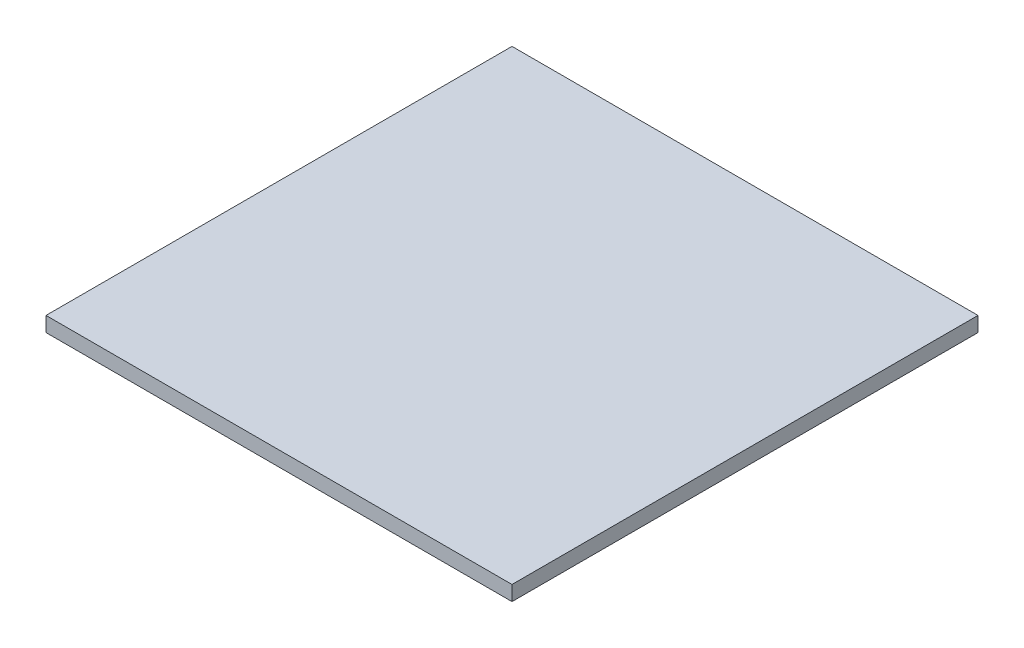
ISO-10303-21;
HEADER;
FILE_DESCRIPTION(('STEP AP214'),'2;1');
FILE_NAME('part.step','',(''),(''),'','','');
FILE_SCHEMA(('AUTOMOTIVE_DESIGN { 1 0 10303 214 1 1 1 1 }'));
ENDSEC;
DATA;
#1=APPLICATION_CONTEXT('core data for automotive mechanical design processes');
#2=APPLICATION_PROTOCOL_DEFINITION('international standard','automotive_design',2000,#1);
#3=PRODUCT_CONTEXT('',#1,'mechanical');
#4=PRODUCT('Part','Part','',(#3));
#5=PRODUCT_RELATED_PRODUCT_CATEGORY('part','',(#4));
#6=PRODUCT_DEFINITION_FORMATION('','',#4);
#7=PRODUCT_DEFINITION_CONTEXT('part definition',#1,'design');
#8=PRODUCT_DEFINITION('design','',#6,#7);
#9=PRODUCT_DEFINITION_SHAPE('','',#8);
#10=(LENGTH_UNIT() NAMED_UNIT(*) SI_UNIT(.MILLI.,.METRE.));
#11=(NAMED_UNIT(*) PLANE_ANGLE_UNIT() SI_UNIT($,.RADIAN.));
#12=(NAMED_UNIT(*) SI_UNIT($,.STERADIAN.) SOLID_ANGLE_UNIT());
#13=UNCERTAINTY_MEASURE_WITH_UNIT(LENGTH_MEASURE(1.E-05),#10,'distance_accuracy_value','');
#14=(GEOMETRIC_REPRESENTATION_CONTEXT(3) GLOBAL_UNCERTAINTY_ASSIGNED_CONTEXT((#13)) GLOBAL_UNIT_ASSIGNED_CONTEXT((#10,
#11,#12)) REPRESENTATION_CONTEXT('',''));
#15=CARTESIAN_POINT('',(0.,0.,0.));
#16=DIRECTION('',(0.,0.,1.));
#17=DIRECTION('',(1.,0.,0.));
#18=AXIS2_PLACEMENT_3D('',#15,#16,#17);
#19=CARTESIAN_POINT('',(47.,3.,47.));
#20=DIRECTION('',(-1.,0.,0.));
#21=DIRECTION('',(0.,0.,1.));
#22=AXIS2_PLACEMENT_3D('',#19,#20,#21);
#23=PLANE('',#22);
#24=DIRECTION('',(0.,0.,-1.));
#25=VECTOR('',#24,1.);
#26=CARTESIAN_POINT('',(47.,0.,47.));
#27=LINE('',#26,#25);
#28=CARTESIAN_POINT('',(47.,0.,47.));
#29=VERTEX_POINT('',#28);
#30=CARTESIAN_POINT('',(47.,0.,-47.));
#31=VERTEX_POINT('',#30);
#32=EDGE_CURVE('E107',#29,#31,#27,.T.);
#33=ORIENTED_EDGE('',*,*,#32,.T.);
#34=DIRECTION('',(0.,-1.,0.));
#35=VECTOR('',#34,1.);
#36=CARTESIAN_POINT('',(47.,3.,-47.));
#37=LINE('',#36,#35);
#38=CARTESIAN_POINT('',(47.,3.,-47.));
#39=VERTEX_POINT('',#38);
#40=EDGE_CURVE('E11',#39,#31,#37,.T.);
#41=ORIENTED_EDGE('',*,*,#40,.F.);
#42=DIRECTION('',(0.,0.,-1.));
#43=VECTOR('',#42,1.);
#44=CARTESIAN_POINT('',(47.,3.,47.));
#45=LINE('',#44,#43);
#46=CARTESIAN_POINT('',(47.,3.,47.));
#47=VERTEX_POINT('',#46);
#48=EDGE_CURVE('E91',#47,#39,#45,.T.);
#49=ORIENTED_EDGE('',*,*,#48,.F.);
#50=DIRECTION('',(0.,-1.,0.));
#51=VECTOR('',#50,1.);
#52=CARTESIAN_POINT('',(47.,3.,47.));
#53=LINE('',#52,#51);
#54=EDGE_CURVE('E103',#47,#29,#53,.T.);
#55=ORIENTED_EDGE('',*,*,#54,.T.);
#56=EDGE_LOOP('',(#33,#41,#49,#55));
#57=FACE_BOUND('',#56,.T.);
#58=ADVANCED_FACE('F39',(#57),#23,.F.);
#59=CARTESIAN_POINT('',(-47.,3.,-47.));
#60=DIRECTION('',(0.,0.,1.));
#61=DIRECTION('',(1.,0.,0.));
#62=AXIS2_PLACEMENT_3D('',#59,#60,#61);
#63=PLANE('',#62);
#64=DIRECTION('',(-1.,0.,0.));
#65=VECTOR('',#64,1.);
#66=CARTESIAN_POINT('',(-47.,0.,-47.));
#67=LINE('',#66,#65);
#68=CARTESIAN_POINT('',(-47.,0.,-47.));
#69=VERTEX_POINT('',#68);
#70=EDGE_CURVE('E96',#31,#69,#67,.T.);
#71=ORIENTED_EDGE('',*,*,#70,.T.);
#72=DIRECTION('',(0.,-1.,0.));
#73=VECTOR('',#72,1.);
#74=CARTESIAN_POINT('',(-47.,3.,-47.));
#75=LINE('',#74,#73);
#76=CARTESIAN_POINT('',(-47.,3.,-47.));
#77=VERTEX_POINT('',#76);
#78=EDGE_CURVE('E48',#77,#69,#75,.T.);
#79=ORIENTED_EDGE('',*,*,#78,.F.);
#80=DIRECTION('',(-1.,0.,0.));
#81=VECTOR('',#80,1.);
#82=CARTESIAN_POINT('',(-47.,3.,-47.));
#83=LINE('',#82,#81);
#84=EDGE_CURVE('E86',#39,#77,#83,.T.);
#85=ORIENTED_EDGE('',*,*,#84,.F.);
#86=ORIENTED_EDGE('',*,*,#40,.T.);
#87=EDGE_LOOP('',(#71,#79,#85,#86));
#88=FACE_BOUND('',#87,.T.);
#89=ADVANCED_FACE('F95',(#88),#63,.F.);
#90=CARTESIAN_POINT('',(-47.,3.,47.));
#91=DIRECTION('',(1.,0.,0.));
#92=DIRECTION('',(0.,0.,-1.));
#93=AXIS2_PLACEMENT_3D('',#90,#91,#92);
#94=PLANE('',#93);
#95=DIRECTION('',(0.,0.,1.));
#96=VECTOR('',#95,1.);
#97=CARTESIAN_POINT('',(-47.,0.,47.));
#98=LINE('',#97,#96);
#99=CARTESIAN_POINT('',(-47.,0.,47.));
#100=VERTEX_POINT('',#99);
#101=EDGE_CURVE('E73',#69,#100,#98,.T.);
#102=ORIENTED_EDGE('',*,*,#101,.T.);
#103=DIRECTION('',(0.,-1.,0.));
#104=VECTOR('',#103,1.);
#105=CARTESIAN_POINT('',(-47.,3.,47.));
#106=LINE('',#105,#104);
#107=CARTESIAN_POINT('',(-47.,3.,47.));
#108=VERTEX_POINT('',#107);
#109=EDGE_CURVE('E98',#108,#100,#106,.T.);
#110=ORIENTED_EDGE('',*,*,#109,.F.);
#111=DIRECTION('',(0.,0.,1.));
#112=VECTOR('',#111,1.);
#113=CARTESIAN_POINT('',(-47.,3.,47.));
#114=LINE('',#113,#112);
#115=EDGE_CURVE('E89',#77,#108,#114,.T.);
#116=ORIENTED_EDGE('',*,*,#115,.F.);
#117=ORIENTED_EDGE('',*,*,#78,.T.);
#118=EDGE_LOOP('',(#102,#110,#116,#117));
#119=FACE_BOUND('',#118,.T.);
#120=ADVANCED_FACE('F99',(#119),#94,.F.);
#121=CARTESIAN_POINT('',(-47.,3.,47.));
#122=DIRECTION('',(0.,0.,-1.));
#123=DIRECTION('',(-1.,0.,0.));
#124=AXIS2_PLACEMENT_3D('',#121,#122,#123);
#125=PLANE('',#124);
#126=DIRECTION('',(1.,0.,0.));
#127=VECTOR('',#126,1.);
#128=CARTESIAN_POINT('',(-47.,0.,47.));
#129=LINE('',#128,#127);
#130=EDGE_CURVE('E79',#100,#29,#129,.T.);
#131=ORIENTED_EDGE('',*,*,#130,.T.);
#132=ORIENTED_EDGE('',*,*,#54,.F.);
#133=DIRECTION('',(1.,0.,0.));
#134=VECTOR('',#133,1.);
#135=CARTESIAN_POINT('',(-47.,3.,47.));
#136=LINE('',#135,#134);
#137=EDGE_CURVE('E56',#108,#47,#136,.T.);
#138=ORIENTED_EDGE('',*,*,#137,.F.);
#139=ORIENTED_EDGE('',*,*,#109,.T.);
#140=EDGE_LOOP('',(#131,#132,#138,#139));
#141=FACE_BOUND('',#140,.T.);
#142=ADVANCED_FACE('F120',(#141),#125,.F.);
#143=CARTESIAN_POINT('',(0.,3.,0.));
#144=DIRECTION('',(0.,-1.,0.));
#145=DIRECTION('',(0.,0.,-1.));
#146=AXIS2_PLACEMENT_3D('',#143,#144,#145);
#147=PLANE('',#146);
#148=ORIENTED_EDGE('',*,*,#48,.T.);
#149=ORIENTED_EDGE('',*,*,#84,.T.);
#150=ORIENTED_EDGE('',*,*,#115,.T.);
#151=ORIENTED_EDGE('',*,*,#137,.T.);
#152=EDGE_LOOP('',(#148,#149,#150,#151));
#153=FACE_BOUND('',#152,.T.);
#154=ADVANCED_FACE('F87',(#153),#147,.F.);
#155=CARTESIAN_POINT('',(0.,0.,0.));
#156=DIRECTION('',(0.,-1.,0.));
#157=DIRECTION('',(0.,0.,-1.));
#158=AXIS2_PLACEMENT_3D('',#155,#156,#157);
#159=PLANE('',#158);
#160=ORIENTED_EDGE('',*,*,#32,.F.);
#161=ORIENTED_EDGE('',*,*,#130,.F.);
#162=ORIENTED_EDGE('',*,*,#101,.F.);
#163=ORIENTED_EDGE('',*,*,#70,.F.);
#164=EDGE_LOOP('',(#160,#161,#162,#163));
#165=FACE_BOUND('',#164,.T.);
#166=ADVANCED_FACE('F123',(#165),#159,.T.);
#167=CLOSED_SHELL('',(#58,#89,#120,#142,#154,#166));
#168=MANIFOLD_SOLID_BREP('B2',#167);
#169=ADVANCED_BREP_SHAPE_REPRESENTATION('',(#18,#168),#14);
#170=SHAPE_DEFINITION_REPRESENTATION(#9,#169);
ENDSEC;
END-ISO-10303-21;
